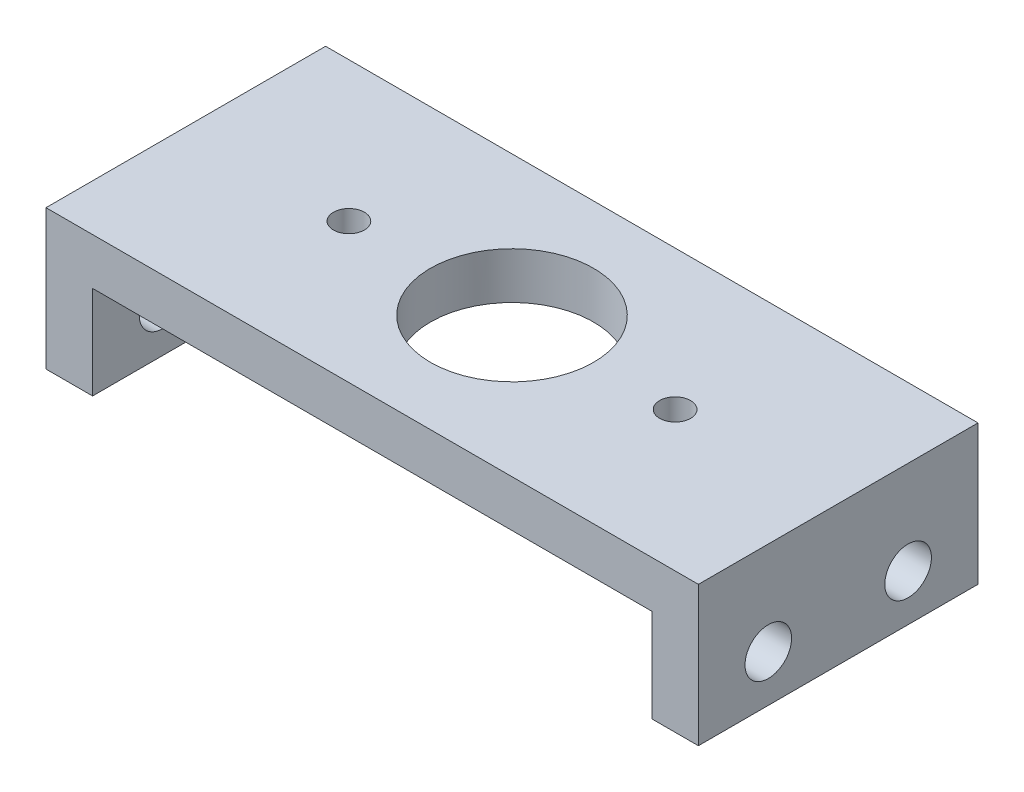
ISO-10303-21;
HEADER;
FILE_DESCRIPTION(('STEP AP214'),'2;1');
FILE_NAME('part.step','',(''),(''),'','','');
FILE_SCHEMA(('AUTOMOTIVE_DESIGN { 1 0 10303 214 1 1 1 1 }'));
ENDSEC;
DATA;
#1=APPLICATION_CONTEXT('core data for automotive mechanical design processes');
#2=APPLICATION_PROTOCOL_DEFINITION('international standard','automotive_design',2000,#1);
#3=PRODUCT_CONTEXT('',#1,'mechanical');
#4=PRODUCT('Part','Part','',(#3));
#5=PRODUCT_RELATED_PRODUCT_CATEGORY('part','',(#4));
#6=PRODUCT_DEFINITION_FORMATION('','',#4);
#7=PRODUCT_DEFINITION_CONTEXT('part definition',#1,'design');
#8=PRODUCT_DEFINITION('design','',#6,#7);
#9=PRODUCT_DEFINITION_SHAPE('','',#8);
#10=(LENGTH_UNIT() NAMED_UNIT(*) SI_UNIT(.MILLI.,.METRE.));
#11=(NAMED_UNIT(*) PLANE_ANGLE_UNIT() SI_UNIT($,.RADIAN.));
#12=(NAMED_UNIT(*) SI_UNIT($,.STERADIAN.) SOLID_ANGLE_UNIT());
#13=UNCERTAINTY_MEASURE_WITH_UNIT(LENGTH_MEASURE(1.E-05),#10,'distance_accuracy_value','');
#14=(GEOMETRIC_REPRESENTATION_CONTEXT(3) GLOBAL_UNCERTAINTY_ASSIGNED_CONTEXT((#13)) GLOBAL_UNIT_ASSIGNED_CONTEXT((#10,
#11,#12)) REPRESENTATION_CONTEXT('',''));
#15=CARTESIAN_POINT('',(0.,0.,0.));
#16=DIRECTION('',(0.,0.,1.));
#17=DIRECTION('',(1.,0.,0.));
#18=AXIS2_PLACEMENT_3D('',#15,#16,#17);
#19=CARTESIAN_POINT('',(177.8,38.1,76.2));
#20=DIRECTION('',(-1.,0.,0.));
#21=DIRECTION('',(0.,-1.,0.));
#22=AXIS2_PLACEMENT_3D('',#19,#20,#21);
#23=PLANE('',#22);
#24=CARTESIAN_POINT('',(177.8,12.7,19.05));
#25=DIRECTION('',(1.,0.,0.));
#26=DIRECTION('',(0.,0.,-1.));
#27=AXIS2_PLACEMENT_3D('',#24,#25,#26);
#28=CIRCLE('',#27,6.34999999999999);
#29=CARTESIAN_POINT('',(177.8,12.7,12.7));
#30=VERTEX_POINT('',#29);
#31=EDGE_CURVE('E246',#30,#30,#28,.T.);
#32=ORIENTED_EDGE('',*,*,#31,.F.);
#33=EDGE_LOOP('',(#32));
#34=FACE_BOUND('',#33,.T.);
#35=DIRECTION('',(0.,1.,0.));
#36=VECTOR('',#35,1.);
#37=CARTESIAN_POINT('',(177.8,38.1,0.));
#38=LINE('',#37,#36);
#39=CARTESIAN_POINT('',(177.8,0.,0.));
#40=VERTEX_POINT('',#39);
#41=CARTESIAN_POINT('',(177.8,38.1,0.));
#42=VERTEX_POINT('',#41);
#43=EDGE_CURVE('E128',#40,#42,#38,.T.);
#44=ORIENTED_EDGE('',*,*,#43,.T.);
#45=DIRECTION('',(0.,0.,-1.));
#46=VECTOR('',#45,1.);
#47=CARTESIAN_POINT('',(177.8,38.1,76.2));
#48=LINE('',#47,#46);
#49=CARTESIAN_POINT('',(177.8,38.1,76.2));
#50=VERTEX_POINT('',#49);
#51=EDGE_CURVE('E125',#50,#42,#48,.T.);
#52=ORIENTED_EDGE('',*,*,#51,.F.);
#53=DIRECTION('',(0.,1.,0.));
#54=VECTOR('',#53,1.);
#55=CARTESIAN_POINT('',(177.8,38.1,76.2));
#56=LINE('',#55,#54);
#57=CARTESIAN_POINT('',(177.8,0.,76.2));
#58=VERTEX_POINT('',#57);
#59=EDGE_CURVE('E113',#58,#50,#56,.T.);
#60=ORIENTED_EDGE('',*,*,#59,.F.);
#61=DIRECTION('',(0.,0.,-1.));
#62=VECTOR('',#61,1.);
#63=CARTESIAN_POINT('',(177.8,0.,76.2));
#64=LINE('',#63,#62);
#65=EDGE_CURVE('E130',#58,#40,#64,.T.);
#66=ORIENTED_EDGE('',*,*,#65,.T.);
#67=EDGE_LOOP('',(#44,#52,#60,#66));
#68=FACE_BOUND('',#67,.T.);
#69=CARTESIAN_POINT('',(177.8,12.7,57.15));
#70=DIRECTION('',(1.,0.,0.));
#71=DIRECTION('',(0.,0.,-1.));
#72=AXIS2_PLACEMENT_3D('',#69,#70,#71);
#73=CIRCLE('',#72,6.34999999999999);
#74=CARTESIAN_POINT('',(177.8,12.7,50.8));
#75=VERTEX_POINT('',#74);
#76=EDGE_CURVE('E262',#75,#75,#73,.T.);
#77=ORIENTED_EDGE('',*,*,#76,.F.);
#78=EDGE_LOOP('',(#77));
#79=FACE_BOUND('',#78,.T.);
#80=ADVANCED_FACE('F39',(#34,#68,#79),#23,.F.);
#81=CARTESIAN_POINT('',(12.7,0.,76.2));
#82=DIRECTION('',(0.,1.,0.));
#83=DIRECTION('',(-1.,0.,0.));
#84=AXIS2_PLACEMENT_3D('',#81,#82,#83);
#85=PLANE('',#84);
#86=DIRECTION('',(1.,0.,0.));
#87=VECTOR('',#86,1.);
#88=CARTESIAN_POINT('',(12.7,0.,0.));
#89=LINE('',#88,#87);
#90=CARTESIAN_POINT('',(0.,0.,0.));
#91=VERTEX_POINT('',#90);
#92=CARTESIAN_POINT('',(12.7,0.,0.));
#93=VERTEX_POINT('',#92);
#94=EDGE_CURVE('E142',#91,#93,#89,.T.);
#95=ORIENTED_EDGE('',*,*,#94,.T.);
#96=DIRECTION('',(0.,0.,-1.));
#97=VECTOR('',#96,1.);
#98=CARTESIAN_POINT('',(12.7,0.,76.2));
#99=LINE('',#98,#97);
#100=CARTESIAN_POINT('',(12.7,0.,76.2));
#101=VERTEX_POINT('',#100);
#102=EDGE_CURVE('E11',#101,#93,#99,.T.);
#103=ORIENTED_EDGE('',*,*,#102,.F.);
#104=DIRECTION('',(1.,0.,0.));
#105=VECTOR('',#104,1.);
#106=CARTESIAN_POINT('',(12.7,0.,76.2));
#107=LINE('',#106,#105);
#108=CARTESIAN_POINT('',(0.,0.,76.2));
#109=VERTEX_POINT('',#108);
#110=EDGE_CURVE('E165',#109,#101,#107,.T.);
#111=ORIENTED_EDGE('',*,*,#110,.F.);
#112=DIRECTION('',(0.,0.,-1.));
#113=VECTOR('',#112,1.);
#114=CARTESIAN_POINT('',(0.,0.,76.2));
#115=LINE('',#114,#113);
#116=EDGE_CURVE('E138',#109,#91,#115,.T.);
#117=ORIENTED_EDGE('',*,*,#116,.T.);
#118=EDGE_LOOP('',(#95,#103,#111,#117));
#119=FACE_BOUND('',#118,.T.);
#120=ADVANCED_FACE('F41',(#119),#85,.F.);
#121=CARTESIAN_POINT('',(12.7,25.4,76.2));
#122=DIRECTION('',(-1.,0.,0.));
#123=DIRECTION('',(0.,-1.,0.));
#124=AXIS2_PLACEMENT_3D('',#121,#122,#123);
#125=PLANE('',#124);
#126=CARTESIAN_POINT('',(12.7,12.7,57.15));
#127=DIRECTION('',(-1.,0.,0.));
#128=DIRECTION('',(0.,-1.,0.));
#129=AXIS2_PLACEMENT_3D('',#126,#127,#128);
#130=CIRCLE('',#129,6.34999999999998);
#131=CARTESIAN_POINT('',(12.7,6.35000000000002,57.15));
#132=VERTEX_POINT('',#131);
#133=EDGE_CURVE('E254',#132,#132,#130,.T.);
#134=ORIENTED_EDGE('',*,*,#133,.T.);
#135=EDGE_LOOP('',(#134));
#136=FACE_BOUND('',#135,.T.);
#137=CARTESIAN_POINT('',(12.7,12.7,19.05));
#138=DIRECTION('',(-1.,0.,0.));
#139=DIRECTION('',(0.,-1.,0.));
#140=AXIS2_PLACEMENT_3D('',#137,#138,#139);
#141=CIRCLE('',#140,6.34999999999998);
#142=CARTESIAN_POINT('',(12.7,6.35000000000002,19.05));
#143=VERTEX_POINT('',#142);
#144=EDGE_CURVE('E234',#143,#143,#141,.T.);
#145=ORIENTED_EDGE('',*,*,#144,.T.);
#146=EDGE_LOOP('',(#145));
#147=FACE_BOUND('',#146,.T.);
#148=DIRECTION('',(0.,1.,0.));
#149=VECTOR('',#148,1.);
#150=CARTESIAN_POINT('',(12.7,25.4,0.));
#151=LINE('',#150,#149);
#152=CARTESIAN_POINT('',(12.7,25.4,0.));
#153=VERTEX_POINT('',#152);
#154=EDGE_CURVE('E146',#93,#153,#151,.T.);
#155=ORIENTED_EDGE('',*,*,#154,.T.);
#156=DIRECTION('',(0.,0.,-1.));
#157=VECTOR('',#156,1.);
#158=CARTESIAN_POINT('',(12.7,25.4,76.2));
#159=LINE('',#158,#157);
#160=CARTESIAN_POINT('',(12.7,25.4,76.2));
#161=VERTEX_POINT('',#160);
#162=EDGE_CURVE('E49',#161,#153,#159,.T.);
#163=ORIENTED_EDGE('',*,*,#162,.F.);
#164=DIRECTION('',(0.,1.,0.));
#165=VECTOR('',#164,1.);
#166=CARTESIAN_POINT('',(12.7,25.4,76.2));
#167=LINE('',#166,#165);
#168=EDGE_CURVE('E100',#101,#161,#167,.T.);
#169=ORIENTED_EDGE('',*,*,#168,.F.);
#170=ORIENTED_EDGE('',*,*,#102,.T.);
#171=EDGE_LOOP('',(#155,#163,#169,#170));
#172=FACE_BOUND('',#171,.T.);
#173=ADVANCED_FACE('F276',(#136,#147,#172),#125,.F.);
#174=CARTESIAN_POINT('',(165.1,25.4,76.2));
#175=DIRECTION('',(0.,1.,0.));
#176=DIRECTION('',(-1.,0.,0.));
#177=AXIS2_PLACEMENT_3D('',#174,#175,#176);
#178=PLANE('',#177);
#179=CARTESIAN_POINT('',(44.45,25.4,38.1));
#180=DIRECTION('',(0.,1.,0.));
#181=DIRECTION('',(-1.,0.,0.));
#182=AXIS2_PLACEMENT_3D('',#179,#180,#181);
#183=CIRCLE('',#182,4.21639999999999);
#184=CARTESIAN_POINT('',(40.2336,25.4,38.1));
#185=VERTEX_POINT('',#184);
#186=EDGE_CURVE('E226',#185,#185,#183,.T.);
#187=ORIENTED_EDGE('',*,*,#186,.T.);
#188=EDGE_LOOP('',(#187));
#189=FACE_BOUND('',#188,.T.);
#190=CARTESIAN_POINT('',(133.35,25.4,38.1));
#191=DIRECTION('',(0.,1.,0.));
#192=DIRECTION('',(-1.,0.,0.));
#193=AXIS2_PLACEMENT_3D('',#190,#191,#192);
#194=CIRCLE('',#193,4.21639999999998);
#195=CARTESIAN_POINT('',(129.1336,25.4,38.1));
#196=VERTEX_POINT('',#195);
#197=EDGE_CURVE('E218',#196,#196,#194,.T.);
#198=ORIENTED_EDGE('',*,*,#197,.T.);
#199=EDGE_LOOP('',(#198));
#200=FACE_BOUND('',#199,.T.);
#201=CARTESIAN_POINT('',(88.9,25.4,38.1));
#202=DIRECTION('',(0.,1.,0.));
#203=DIRECTION('',(-1.,0.,0.));
#204=AXIS2_PLACEMENT_3D('',#201,#202,#203);
#205=CIRCLE('',#204,22.225);
#206=CARTESIAN_POINT('',(66.675,25.4,38.1));
#207=VERTEX_POINT('',#206);
#208=EDGE_CURVE('E147',#207,#207,#205,.T.);
#209=ORIENTED_EDGE('',*,*,#208,.T.);
#210=EDGE_LOOP('',(#209));
#211=FACE_BOUND('',#210,.T.);
#212=DIRECTION('',(1.,0.,0.));
#213=VECTOR('',#212,1.);
#214=CARTESIAN_POINT('',(165.1,25.4,0.));
#215=LINE('',#214,#213);
#216=CARTESIAN_POINT('',(165.1,25.4,0.));
#217=VERTEX_POINT('',#216);
#218=EDGE_CURVE('E150',#153,#217,#215,.T.);
#219=ORIENTED_EDGE('',*,*,#218,.T.);
#220=DIRECTION('',(0.,0.,-1.));
#221=VECTOR('',#220,1.);
#222=CARTESIAN_POINT('',(165.1,25.4,76.2));
#223=LINE('',#222,#221);
#224=CARTESIAN_POINT('',(165.1,25.4,76.2));
#225=VERTEX_POINT('',#224);
#226=EDGE_CURVE('E176',#225,#217,#223,.T.);
#227=ORIENTED_EDGE('',*,*,#226,.F.);
#228=DIRECTION('',(1.,0.,0.));
#229=VECTOR('',#228,1.);
#230=CARTESIAN_POINT('',(165.1,25.4,76.2));
#231=LINE('',#230,#229);
#232=EDGE_CURVE('E187',#161,#225,#231,.T.);
#233=ORIENTED_EDGE('',*,*,#232,.F.);
#234=ORIENTED_EDGE('',*,*,#162,.T.);
#235=EDGE_LOOP('',(#219,#227,#233,#234));
#236=FACE_BOUND('',#235,.T.);
#237=ADVANCED_FACE('F185',(#189,#200,#211,#236),#178,.F.);
#238=CARTESIAN_POINT('',(165.1,0.,76.2));
#239=DIRECTION('',(1.,0.,0.));
#240=DIRECTION('',(0.,0.,-1.));
#241=AXIS2_PLACEMENT_3D('',#238,#239,#240);
#242=PLANE('',#241);
#243=CARTESIAN_POINT('',(165.1,12.7,57.15));
#244=DIRECTION('',(1.,0.,0.));
#245=DIRECTION('',(0.,0.,-1.));
#246=AXIS2_PLACEMENT_3D('',#243,#244,#245);
#247=CIRCLE('',#246,6.34999999999998);
#248=CARTESIAN_POINT('',(165.1,12.7,50.8));
#249=VERTEX_POINT('',#248);
#250=EDGE_CURVE('E250',#249,#249,#247,.T.);
#251=ORIENTED_EDGE('',*,*,#250,.T.);
#252=EDGE_LOOP('',(#251));
#253=FACE_BOUND('',#252,.T.);
#254=CARTESIAN_POINT('',(165.1,12.7,19.05));
#255=DIRECTION('',(1.,0.,0.));
#256=DIRECTION('',(0.,0.,-1.));
#257=AXIS2_PLACEMENT_3D('',#254,#255,#256);
#258=CIRCLE('',#257,6.34999999999998);
#259=CARTESIAN_POINT('',(165.1,12.7,12.7));
#260=VERTEX_POINT('',#259);
#261=EDGE_CURVE('E238',#260,#260,#258,.T.);
#262=ORIENTED_EDGE('',*,*,#261,.T.);
#263=EDGE_LOOP('',(#262));
#264=FACE_BOUND('',#263,.T.);
#265=DIRECTION('',(0.,-1.,0.));
#266=VECTOR('',#265,1.);
#267=CARTESIAN_POINT('',(165.1,0.,0.));
#268=LINE('',#267,#266);
#269=CARTESIAN_POINT('',(165.1,0.,0.));
#270=VERTEX_POINT('',#269);
#271=EDGE_CURVE('E153',#217,#270,#268,.T.);
#272=ORIENTED_EDGE('',*,*,#271,.T.);
#273=DIRECTION('',(0.,0.,-1.));
#274=VECTOR('',#273,1.);
#275=CARTESIAN_POINT('',(165.1,0.,76.2));
#276=LINE('',#275,#274);
#277=CARTESIAN_POINT('',(165.1,0.,76.2));
#278=VERTEX_POINT('',#277);
#279=EDGE_CURVE('E172',#278,#270,#276,.T.);
#280=ORIENTED_EDGE('',*,*,#279,.F.);
#281=DIRECTION('',(0.,-1.,0.));
#282=VECTOR('',#281,1.);
#283=CARTESIAN_POINT('',(165.1,0.,76.2));
#284=LINE('',#283,#282);
#285=EDGE_CURVE('E200',#225,#278,#284,.T.);
#286=ORIENTED_EDGE('',*,*,#285,.F.);
#287=ORIENTED_EDGE('',*,*,#226,.T.);
#288=EDGE_LOOP('',(#272,#280,#286,#287));
#289=FACE_BOUND('',#288,.T.);
#290=ADVANCED_FACE('F195',(#253,#264,#289),#242,.F.);
#291=CARTESIAN_POINT('',(177.8,0.,76.2));
#292=DIRECTION('',(0.,1.,0.));
#293=DIRECTION('',(-1.,0.,0.));
#294=AXIS2_PLACEMENT_3D('',#291,#292,#293);
#295=PLANE('',#294);
#296=DIRECTION('',(1.,0.,0.));
#297=VECTOR('',#296,1.);
#298=CARTESIAN_POINT('',(177.8,0.,0.));
#299=LINE('',#298,#297);
#300=EDGE_CURVE('E156',#270,#40,#299,.T.);
#301=ORIENTED_EDGE('',*,*,#300,.T.);
#302=ORIENTED_EDGE('',*,*,#65,.F.);
#303=DIRECTION('',(1.,0.,0.));
#304=VECTOR('',#303,1.);
#305=CARTESIAN_POINT('',(177.8,0.,76.2));
#306=LINE('',#305,#304);
#307=EDGE_CURVE('E119',#278,#58,#306,.T.);
#308=ORIENTED_EDGE('',*,*,#307,.F.);
#309=ORIENTED_EDGE('',*,*,#279,.T.);
#310=EDGE_LOOP('',(#301,#302,#308,#309));
#311=FACE_BOUND('',#310,.T.);
#312=ADVANCED_FACE('F198',(#311),#295,.F.);
#313=CARTESIAN_POINT('',(0.,38.1,76.2));
#314=DIRECTION('',(0.,-1.,0.));
#315=DIRECTION('',(0.,0.,-1.));
#316=AXIS2_PLACEMENT_3D('',#313,#314,#315);
#317=PLANE('',#316);
#318=CARTESIAN_POINT('',(44.45,38.1,38.1));
#319=DIRECTION('',(0.,1.,0.));
#320=DIRECTION('',(0.,0.,1.));
#321=AXIS2_PLACEMENT_3D('',#318,#319,#320);
#322=CIRCLE('',#321,4.21639999999999);
#323=CARTESIAN_POINT('',(44.45,38.1,42.3164));
#324=VERTEX_POINT('',#323);
#325=EDGE_CURVE('E230',#324,#324,#322,.T.);
#326=ORIENTED_EDGE('',*,*,#325,.F.);
#327=EDGE_LOOP('',(#326));
#328=FACE_BOUND('',#327,.T.);
#329=CARTESIAN_POINT('',(133.35,38.1,38.1));
#330=DIRECTION('',(0.,1.,0.));
#331=DIRECTION('',(0.,0.,1.));
#332=AXIS2_PLACEMENT_3D('',#329,#330,#331);
#333=CIRCLE('',#332,4.21639999999998);
#334=CARTESIAN_POINT('',(133.35,38.1,42.3164));
#335=VERTEX_POINT('',#334);
#336=EDGE_CURVE('E222',#335,#335,#333,.T.);
#337=ORIENTED_EDGE('',*,*,#336,.F.);
#338=EDGE_LOOP('',(#337));
#339=FACE_BOUND('',#338,.T.);
#340=CARTESIAN_POINT('',(88.9,38.1,38.1));
#341=DIRECTION('',(0.,1.,0.));
#342=DIRECTION('',(0.,0.,1.));
#343=AXIS2_PLACEMENT_3D('',#340,#341,#342);
#344=CIRCLE('',#343,22.225);
#345=CARTESIAN_POINT('',(88.9,38.1,60.325));
#346=VERTEX_POINT('',#345);
#347=EDGE_CURVE('E214',#346,#346,#344,.T.);
#348=ORIENTED_EDGE('',*,*,#347,.F.);
#349=EDGE_LOOP('',(#348));
#350=FACE_BOUND('',#349,.T.);
#351=DIRECTION('',(-1.,0.,0.));
#352=VECTOR('',#351,1.);
#353=CARTESIAN_POINT('',(0.,38.1,0.));
#354=LINE('',#353,#352);
#355=CARTESIAN_POINT('',(0.,38.1,0.));
#356=VERTEX_POINT('',#355);
#357=EDGE_CURVE('E86',#42,#356,#354,.T.);
#358=ORIENTED_EDGE('',*,*,#357,.T.);
#359=DIRECTION('',(0.,0.,-1.));
#360=VECTOR('',#359,1.);
#361=CARTESIAN_POINT('',(0.,38.1,76.2));
#362=LINE('',#361,#360);
#363=CARTESIAN_POINT('',(0.,38.1,76.2));
#364=VERTEX_POINT('',#363);
#365=EDGE_CURVE('E131',#364,#356,#362,.T.);
#366=ORIENTED_EDGE('',*,*,#365,.F.);
#367=DIRECTION('',(-1.,0.,0.));
#368=VECTOR('',#367,1.);
#369=CARTESIAN_POINT('',(0.,38.1,76.2));
#370=LINE('',#369,#368);
#371=EDGE_CURVE('E117',#50,#364,#370,.T.);
#372=ORIENTED_EDGE('',*,*,#371,.F.);
#373=ORIENTED_EDGE('',*,*,#51,.T.);
#374=EDGE_LOOP('',(#358,#366,#372,#373));
#375=FACE_BOUND('',#374,.T.);
#376=ADVANCED_FACE('F133',(#328,#339,#350,#375),#317,.F.);
#377=CARTESIAN_POINT('',(0.,0.,76.2));
#378=DIRECTION('',(1.,0.,0.));
#379=DIRECTION('',(0.,1.,0.));
#380=AXIS2_PLACEMENT_3D('',#377,#378,#379);
#381=PLANE('',#380);
#382=CARTESIAN_POINT('',(0.,12.7,57.15));
#383=DIRECTION('',(1.,0.,0.));
#384=DIRECTION('',(0.,0.,-1.));
#385=AXIS2_PLACEMENT_3D('',#382,#383,#384);
#386=CIRCLE('',#385,6.34999999999997);
#387=CARTESIAN_POINT('',(0.,12.7,50.8));
#388=VERTEX_POINT('',#387);
#389=EDGE_CURVE('E258',#388,#388,#386,.T.);
#390=ORIENTED_EDGE('',*,*,#389,.T.);
#391=EDGE_LOOP('',(#390));
#392=FACE_BOUND('',#391,.T.);
#393=CARTESIAN_POINT('',(0.,12.7,19.05));
#394=DIRECTION('',(1.,0.,0.));
#395=DIRECTION('',(0.,0.,-1.));
#396=AXIS2_PLACEMENT_3D('',#393,#394,#395);
#397=CIRCLE('',#396,6.34999999999997);
#398=CARTESIAN_POINT('',(0.,12.7,12.7));
#399=VERTEX_POINT('',#398);
#400=EDGE_CURVE('E242',#399,#399,#397,.T.);
#401=ORIENTED_EDGE('',*,*,#400,.T.);
#402=EDGE_LOOP('',(#401));
#403=FACE_BOUND('',#402,.T.);
#404=DIRECTION('',(0.,-1.,0.));
#405=VECTOR('',#404,1.);
#406=CARTESIAN_POINT('',(0.,0.,0.));
#407=LINE('',#406,#405);
#408=EDGE_CURVE('E92',#356,#91,#407,.T.);
#409=ORIENTED_EDGE('',*,*,#408,.T.);
#410=ORIENTED_EDGE('',*,*,#116,.F.);
#411=DIRECTION('',(0.,-1.,0.));
#412=VECTOR('',#411,1.);
#413=CARTESIAN_POINT('',(0.,0.,76.2));
#414=LINE('',#413,#412);
#415=EDGE_CURVE('E57',#364,#109,#414,.T.);
#416=ORIENTED_EDGE('',*,*,#415,.F.);
#417=ORIENTED_EDGE('',*,*,#365,.T.);
#418=EDGE_LOOP('',(#409,#410,#416,#417));
#419=FACE_BOUND('',#418,.T.);
#420=ADVANCED_FACE('F298',(#392,#403,#419),#381,.F.);
#421=CARTESIAN_POINT('',(0.,0.,76.2));
#422=DIRECTION('',(0.,0.,-1.));
#423=DIRECTION('',(-1.,0.,0.));
#424=AXIS2_PLACEMENT_3D('',#421,#422,#423);
#425=PLANE('',#424);
#426=ORIENTED_EDGE('',*,*,#110,.T.);
#427=ORIENTED_EDGE('',*,*,#168,.T.);
#428=ORIENTED_EDGE('',*,*,#232,.T.);
#429=ORIENTED_EDGE('',*,*,#285,.T.);
#430=ORIENTED_EDGE('',*,*,#307,.T.);
#431=ORIENTED_EDGE('',*,*,#59,.T.);
#432=ORIENTED_EDGE('',*,*,#371,.T.);
#433=ORIENTED_EDGE('',*,*,#415,.T.);
#434=EDGE_LOOP('',(#426,#427,#428,#429,#430,#431,#432,#433));
#435=FACE_BOUND('',#434,.T.);
#436=ADVANCED_FACE('F115',(#435),#425,.F.);
#437=CARTESIAN_POINT('',(0.,0.,0.));
#438=DIRECTION('',(0.,0.,-1.));
#439=DIRECTION('',(-1.,0.,0.));
#440=AXIS2_PLACEMENT_3D('',#437,#438,#439);
#441=PLANE('',#440);
#442=ORIENTED_EDGE('',*,*,#94,.F.);
#443=ORIENTED_EDGE('',*,*,#408,.F.);
#444=ORIENTED_EDGE('',*,*,#357,.F.);
#445=ORIENTED_EDGE('',*,*,#43,.F.);
#446=ORIENTED_EDGE('',*,*,#300,.F.);
#447=ORIENTED_EDGE('',*,*,#271,.F.);
#448=ORIENTED_EDGE('',*,*,#218,.F.);
#449=ORIENTED_EDGE('',*,*,#154,.F.);
#450=EDGE_LOOP('',(#442,#443,#444,#445,#446,#447,#448,#449));
#451=FACE_BOUND('',#450,.T.);
#452=ADVANCED_FACE('F191',(#451),#441,.T.);
#453=CARTESIAN_POINT('',(88.9,38.1,38.1));
#454=DIRECTION('',(0.,1.,0.));
#455=DIRECTION('',(0.,0.,1.));
#456=AXIS2_PLACEMENT_3D('',#453,#454,#455);
#457=CYLINDRICAL_SURFACE('',#456,22.225);
#458=ORIENTED_EDGE('',*,*,#347,.T.);
#459=EDGE_LOOP('',(#458));
#460=FACE_BOUND('',#459,.T.);
#461=ORIENTED_EDGE('',*,*,#208,.F.);
#462=EDGE_LOOP('',(#461));
#463=FACE_BOUND('',#462,.T.);
#464=ADVANCED_FACE('F310',(#460,#463),#457,.F.);
#465=CARTESIAN_POINT('',(133.35,38.1,38.1));
#466=DIRECTION('',(0.,1.,0.));
#467=DIRECTION('',(0.,0.,1.));
#468=AXIS2_PLACEMENT_3D('',#465,#466,#467);
#469=CYLINDRICAL_SURFACE('',#468,4.21639999999998);
#470=ORIENTED_EDGE('',*,*,#336,.T.);
#471=EDGE_LOOP('',(#470));
#472=FACE_BOUND('',#471,.T.);
#473=ORIENTED_EDGE('',*,*,#197,.F.);
#474=EDGE_LOOP('',(#473));
#475=FACE_BOUND('',#474,.T.);
#476=ADVANCED_FACE('F314',(#472,#475),#469,.F.);
#477=CARTESIAN_POINT('',(44.45,38.1,38.1));
#478=DIRECTION('',(0.,1.,0.));
#479=DIRECTION('',(0.,0.,1.));
#480=AXIS2_PLACEMENT_3D('',#477,#478,#479);
#481=CYLINDRICAL_SURFACE('',#480,4.21639999999999);
#482=ORIENTED_EDGE('',*,*,#325,.T.);
#483=EDGE_LOOP('',(#482));
#484=FACE_BOUND('',#483,.T.);
#485=ORIENTED_EDGE('',*,*,#186,.F.);
#486=EDGE_LOOP('',(#485));
#487=FACE_BOUND('',#486,.T.);
#488=ADVANCED_FACE('F318',(#484,#487),#481,.F.);
#489=CARTESIAN_POINT('',(177.8,12.7,19.05));
#490=DIRECTION('',(1.,0.,0.));
#491=DIRECTION('',(0.,0.,-1.));
#492=AXIS2_PLACEMENT_3D('',#489,#490,#491);
#493=CYLINDRICAL_SURFACE('',#492,6.34999999999998);
#494=ORIENTED_EDGE('',*,*,#31,.T.);
#495=EDGE_LOOP('',(#494));
#496=FACE_BOUND('',#495,.T.);
#497=ORIENTED_EDGE('',*,*,#261,.F.);
#498=EDGE_LOOP('',(#497));
#499=FACE_BOUND('',#498,.T.);
#500=ADVANCED_FACE('F322',(#496,#499),#493,.F.);
#501=ORIENTED_EDGE('',*,*,#400,.F.);
#502=EDGE_LOOP('',(#501));
#503=FACE_BOUND('',#502,.T.);
#504=ORIENTED_EDGE('',*,*,#144,.F.);
#505=EDGE_LOOP('',(#504));
#506=FACE_BOUND('',#505,.T.);
#507=ADVANCED_FACE('F324',(#503,#506),#493,.F.);
#508=CARTESIAN_POINT('',(177.8,12.7,57.15));
#509=DIRECTION('',(1.,0.,0.));
#510=DIRECTION('',(0.,0.,-1.));
#511=AXIS2_PLACEMENT_3D('',#508,#509,#510);
#512=CYLINDRICAL_SURFACE('',#511,6.34999999999998);
#513=ORIENTED_EDGE('',*,*,#389,.F.);
#514=EDGE_LOOP('',(#513));
#515=FACE_BOUND('',#514,.T.);
#516=ORIENTED_EDGE('',*,*,#133,.F.);
#517=EDGE_LOOP('',(#516));
#518=FACE_BOUND('',#517,.T.);
#519=ADVANCED_FACE('F327',(#515,#518),#512,.F.);
#520=ORIENTED_EDGE('',*,*,#76,.T.);
#521=EDGE_LOOP('',(#520));
#522=FACE_BOUND('',#521,.T.);
#523=ORIENTED_EDGE('',*,*,#250,.F.);
#524=EDGE_LOOP('',(#523));
#525=FACE_BOUND('',#524,.T.);
#526=ADVANCED_FACE('F268',(#522,#525),#512,.F.);
#527=CLOSED_SHELL('',(#80,#120,#173,#237,#290,#312,#376,#420,#436,#452,#464,#476,#488,#500,#507,
#519,#526));
#528=MANIFOLD_SOLID_BREP('B2',#527);
#529=ADVANCED_BREP_SHAPE_REPRESENTATION('',(#18,#528),#14);
#530=SHAPE_DEFINITION_REPRESENTATION(#9,#529);
ENDSEC;
END-ISO-10303-21;
